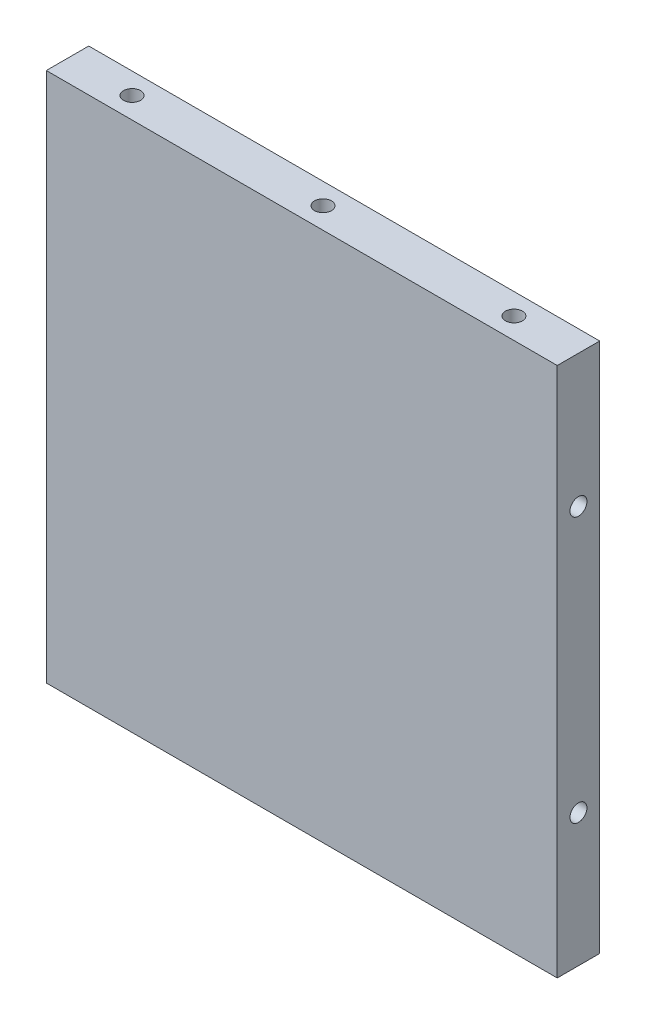
ISO-10303-21;
HEADER;
FILE_DESCRIPTION(('STEP AP214'),'2;1');
FILE_NAME('part.step','',(''),(''),'','','');
FILE_SCHEMA(('AUTOMOTIVE_DESIGN { 1 0 10303 214 1 1 1 1 }'));
ENDSEC;
DATA;
#1=APPLICATION_CONTEXT('core data for automotive mechanical design processes');
#2=APPLICATION_PROTOCOL_DEFINITION('international standard','automotive_design',2000,#1);
#3=PRODUCT_CONTEXT('',#1,'mechanical');
#4=PRODUCT('Part','Part','',(#3));
#5=PRODUCT_RELATED_PRODUCT_CATEGORY('part','',(#4));
#6=PRODUCT_DEFINITION_FORMATION('','',#4);
#7=PRODUCT_DEFINITION_CONTEXT('part definition',#1,'design');
#8=PRODUCT_DEFINITION('design','',#6,#7);
#9=PRODUCT_DEFINITION_SHAPE('','',#8);
#10=(LENGTH_UNIT() NAMED_UNIT(*) SI_UNIT(.MILLI.,.METRE.));
#11=(NAMED_UNIT(*) PLANE_ANGLE_UNIT() SI_UNIT($,.RADIAN.));
#12=(NAMED_UNIT(*) SI_UNIT($,.STERADIAN.) SOLID_ANGLE_UNIT());
#13=UNCERTAINTY_MEASURE_WITH_UNIT(LENGTH_MEASURE(1.E-05),#10,'distance_accuracy_value','');
#14=(GEOMETRIC_REPRESENTATION_CONTEXT(3) GLOBAL_UNCERTAINTY_ASSIGNED_CONTEXT((#13)) GLOBAL_UNIT_ASSIGNED_CONTEXT((#10,
#11,#12)) REPRESENTATION_CONTEXT('',''));
#15=CARTESIAN_POINT('',(0.,0.,0.));
#16=DIRECTION('',(0.,0.,1.));
#17=DIRECTION('',(1.,0.,0.));
#18=AXIS2_PLACEMENT_3D('',#15,#16,#17);
#19=CARTESIAN_POINT('',(0.,125.,0.));
#20=DIRECTION('',(1.,0.,0.));
#21=DIRECTION('',(0.,0.,-1.));
#22=AXIS2_PLACEMENT_3D('',#19,#20,#21);
#23=PLANE('',#22);
#24=CARTESIAN_POINT('',(0.,93.75,-5.));
#25=DIRECTION('',(-1.,0.,0.));
#26=DIRECTION('',(0.,0.,1.));
#27=AXIS2_PLACEMENT_3D('',#24,#25,#26);
#28=CIRCLE('',#27,2.);
#29=CARTESIAN_POINT('',(0.,93.75,-3.));
#30=VERTEX_POINT('',#29);
#31=EDGE_CURVE('E153',#30,#30,#28,.T.);
#32=ORIENTED_EDGE('',*,*,#31,.F.);
#33=EDGE_LOOP('',(#32));
#34=FACE_BOUND('',#33,.T.);
#35=CARTESIAN_POINT('',(0.,31.25,-5.));
#36=DIRECTION('',(-1.,0.,0.));
#37=DIRECTION('',(0.,0.,1.));
#38=AXIS2_PLACEMENT_3D('',#35,#36,#37);
#39=CIRCLE('',#38,2.);
#40=CARTESIAN_POINT('',(0.,31.25,-3.));
#41=VERTEX_POINT('',#40);
#42=EDGE_CURVE('E146',#41,#41,#39,.T.);
#43=ORIENTED_EDGE('',*,*,#42,.F.);
#44=EDGE_LOOP('',(#43));
#45=FACE_BOUND('',#44,.T.);
#46=DIRECTION('',(0.,0.,1.));
#47=VECTOR('',#46,1.);
#48=CARTESIAN_POINT('',(0.,0.,0.));
#49=LINE('',#48,#47);
#50=CARTESIAN_POINT('',(0.,0.,-10.));
#51=VERTEX_POINT('',#50);
#52=CARTESIAN_POINT('',(0.,0.,0.));
#53=VERTEX_POINT('',#52);
#54=EDGE_CURVE('E96',#51,#53,#49,.T.);
#55=ORIENTED_EDGE('',*,*,#54,.T.);
#56=DIRECTION('',(0.,-1.,0.));
#57=VECTOR('',#56,1.);
#58=CARTESIAN_POINT('',(0.,125.,0.));
#59=LINE('',#58,#57);
#60=CARTESIAN_POINT('',(0.,125.,0.));
#61=VERTEX_POINT('',#60);
#62=EDGE_CURVE('E11',#61,#53,#59,.T.);
#63=ORIENTED_EDGE('',*,*,#62,.F.);
#64=DIRECTION('',(0.,0.,1.));
#65=VECTOR('',#64,1.);
#66=CARTESIAN_POINT('',(0.,125.,0.));
#67=LINE('',#66,#65);
#68=CARTESIAN_POINT('',(0.,125.,-10.));
#69=VERTEX_POINT('',#68);
#70=EDGE_CURVE('E84',#69,#61,#67,.T.);
#71=ORIENTED_EDGE('',*,*,#70,.F.);
#72=DIRECTION('',(0.,-1.,0.));
#73=VECTOR('',#72,1.);
#74=CARTESIAN_POINT('',(0.,125.,-10.));
#75=LINE('',#74,#73);
#76=EDGE_CURVE('E92',#69,#51,#75,.T.);
#77=ORIENTED_EDGE('',*,*,#76,.T.);
#78=EDGE_LOOP('',(#55,#63,#71,#77));
#79=FACE_BOUND('',#78,.T.);
#80=ADVANCED_FACE('F33',(#34,#45,#79),#23,.F.);
#81=CARTESIAN_POINT('',(0.,125.,0.));
#82=DIRECTION('',(0.,0.,-1.));
#83=DIRECTION('',(-1.,0.,0.));
#84=AXIS2_PLACEMENT_3D('',#81,#82,#83);
#85=PLANE('',#84);
#86=DIRECTION('',(1.,0.,0.));
#87=VECTOR('',#86,1.);
#88=CARTESIAN_POINT('',(0.,0.,0.));
#89=LINE('',#88,#87);
#90=CARTESIAN_POINT('',(120.4,0.,0.));
#91=VERTEX_POINT('',#90);
#92=EDGE_CURVE('E88',#53,#91,#89,.T.);
#93=ORIENTED_EDGE('',*,*,#92,.T.);
#94=DIRECTION('',(0.,-1.,0.));
#95=VECTOR('',#94,1.);
#96=CARTESIAN_POINT('',(120.4,125.,0.));
#97=LINE('',#96,#95);
#98=CARTESIAN_POINT('',(120.4,125.,0.));
#99=VERTEX_POINT('',#98);
#100=EDGE_CURVE('E41',#99,#91,#97,.T.);
#101=ORIENTED_EDGE('',*,*,#100,.F.);
#102=DIRECTION('',(1.,0.,0.));
#103=VECTOR('',#102,1.);
#104=CARTESIAN_POINT('',(0.,125.,0.));
#105=LINE('',#104,#103);
#106=EDGE_CURVE('E79',#61,#99,#105,.T.);
#107=ORIENTED_EDGE('',*,*,#106,.F.);
#108=ORIENTED_EDGE('',*,*,#62,.T.);
#109=EDGE_LOOP('',(#93,#101,#107,#108));
#110=FACE_BOUND('',#109,.T.);
#111=ADVANCED_FACE('F87',(#110),#85,.F.);
#112=CARTESIAN_POINT('',(120.4,125.,0.));
#113=DIRECTION('',(-1.,0.,0.));
#114=DIRECTION('',(0.,0.,1.));
#115=AXIS2_PLACEMENT_3D('',#112,#113,#114);
#116=PLANE('',#115);
#117=CARTESIAN_POINT('',(120.4,93.75,-5.));
#118=DIRECTION('',(1.,0.,0.));
#119=DIRECTION('',(0.,0.,-1.));
#120=AXIS2_PLACEMENT_3D('',#117,#118,#119);
#121=CIRCLE('',#120,2.);
#122=CARTESIAN_POINT('',(120.4,93.75,-7.));
#123=VERTEX_POINT('',#122);
#124=EDGE_CURVE('E164',#123,#123,#121,.T.);
#125=ORIENTED_EDGE('',*,*,#124,.F.);
#126=EDGE_LOOP('',(#125));
#127=FACE_BOUND('',#126,.T.);
#128=CARTESIAN_POINT('',(120.4,31.25,-5.));
#129=DIRECTION('',(1.,0.,0.));
#130=DIRECTION('',(0.,0.,-1.));
#131=AXIS2_PLACEMENT_3D('',#128,#129,#130);
#132=CIRCLE('',#131,2.);
#133=CARTESIAN_POINT('',(120.4,31.25,-7.));
#134=VERTEX_POINT('',#133);
#135=EDGE_CURVE('E158',#134,#134,#132,.T.);
#136=ORIENTED_EDGE('',*,*,#135,.F.);
#137=EDGE_LOOP('',(#136));
#138=FACE_BOUND('',#137,.T.);
#139=DIRECTION('',(0.,0.,-1.));
#140=VECTOR('',#139,1.);
#141=CARTESIAN_POINT('',(120.4,0.,0.));
#142=LINE('',#141,#140);
#143=CARTESIAN_POINT('',(120.4,0.,-10.));
#144=VERTEX_POINT('',#143);
#145=EDGE_CURVE('E66',#91,#144,#142,.T.);
#146=ORIENTED_EDGE('',*,*,#145,.T.);
#147=DIRECTION('',(0.,-1.,0.));
#148=VECTOR('',#147,1.);
#149=CARTESIAN_POINT('',(120.4,125.,-10.));
#150=LINE('',#149,#148);
#151=CARTESIAN_POINT('',(120.4,125.,-10.));
#152=VERTEX_POINT('',#151);
#153=EDGE_CURVE('E89',#152,#144,#150,.T.);
#154=ORIENTED_EDGE('',*,*,#153,.F.);
#155=DIRECTION('',(0.,0.,-1.));
#156=VECTOR('',#155,1.);
#157=CARTESIAN_POINT('',(120.4,125.,0.));
#158=LINE('',#157,#156);
#159=EDGE_CURVE('E82',#99,#152,#158,.T.);
#160=ORIENTED_EDGE('',*,*,#159,.F.);
#161=ORIENTED_EDGE('',*,*,#100,.T.);
#162=EDGE_LOOP('',(#146,#154,#160,#161));
#163=FACE_BOUND('',#162,.T.);
#164=ADVANCED_FACE('F90',(#127,#138,#163),#116,.F.);
#165=CARTESIAN_POINT('',(0.,125.,-10.));
#166=DIRECTION('',(0.,0.,1.));
#167=DIRECTION('',(1.,0.,0.));
#168=AXIS2_PLACEMENT_3D('',#165,#166,#167);
#169=PLANE('',#168);
#170=DIRECTION('',(-1.,0.,0.));
#171=VECTOR('',#170,1.);
#172=CARTESIAN_POINT('',(0.,0.,-10.));
#173=LINE('',#172,#171);
#174=EDGE_CURVE('E72',#144,#51,#173,.T.);
#175=ORIENTED_EDGE('',*,*,#174,.T.);
#176=ORIENTED_EDGE('',*,*,#76,.F.);
#177=DIRECTION('',(-1.,0.,0.));
#178=VECTOR('',#177,1.);
#179=CARTESIAN_POINT('',(0.,125.,-10.));
#180=LINE('',#179,#178);
#181=EDGE_CURVE('E49',#152,#69,#180,.T.);
#182=ORIENTED_EDGE('',*,*,#181,.F.);
#183=ORIENTED_EDGE('',*,*,#153,.T.);
#184=EDGE_LOOP('',(#175,#176,#182,#183));
#185=FACE_BOUND('',#184,.T.);
#186=ADVANCED_FACE('F104',(#185),#169,.F.);
#187=CARTESIAN_POINT('',(0.,125.,0.));
#188=DIRECTION('',(0.,-1.,0.));
#189=DIRECTION('',(0.,0.,-1.));
#190=AXIS2_PLACEMENT_3D('',#187,#188,#189);
#191=PLANE('',#190);
#192=CARTESIAN_POINT('',(15.2,125.,-5.));
#193=DIRECTION('',(0.,1.,0.));
#194=DIRECTION('',(0.,0.,1.));
#195=AXIS2_PLACEMENT_3D('',#192,#193,#194);
#196=CIRCLE('',#195,2.);
#197=CARTESIAN_POINT('',(15.2,125.,-3.));
#198=VERTEX_POINT('',#197);
#199=EDGE_CURVE('E123',#198,#198,#196,.T.);
#200=ORIENTED_EDGE('',*,*,#199,.F.);
#201=EDGE_LOOP('',(#200));
#202=FACE_BOUND('',#201,.T.);
#203=CARTESIAN_POINT('',(60.2,125.,-5.));
#204=DIRECTION('',(0.,1.,0.));
#205=DIRECTION('',(0.,0.,1.));
#206=AXIS2_PLACEMENT_3D('',#203,#204,#205);
#207=CIRCLE('',#206,2.);
#208=CARTESIAN_POINT('',(60.2,125.,-3.));
#209=VERTEX_POINT('',#208);
#210=EDGE_CURVE('E117',#209,#209,#207,.T.);
#211=ORIENTED_EDGE('',*,*,#210,.F.);
#212=EDGE_LOOP('',(#211));
#213=FACE_BOUND('',#212,.T.);
#214=CARTESIAN_POINT('',(105.2,125.,-5.));
#215=DIRECTION('',(0.,1.,0.));
#216=DIRECTION('',(0.,0.,1.));
#217=AXIS2_PLACEMENT_3D('',#214,#215,#216);
#218=CIRCLE('',#217,2.);
#219=CARTESIAN_POINT('',(105.2,125.,-3.));
#220=VERTEX_POINT('',#219);
#221=EDGE_CURVE('E110',#220,#220,#218,.T.);
#222=ORIENTED_EDGE('',*,*,#221,.F.);
#223=EDGE_LOOP('',(#222));
#224=FACE_BOUND('',#223,.T.);
#225=ORIENTED_EDGE('',*,*,#70,.T.);
#226=ORIENTED_EDGE('',*,*,#106,.T.);
#227=ORIENTED_EDGE('',*,*,#159,.T.);
#228=ORIENTED_EDGE('',*,*,#181,.T.);
#229=EDGE_LOOP('',(#225,#226,#227,#228));
#230=FACE_BOUND('',#229,.T.);
#231=ADVANCED_FACE('F80',(#202,#213,#224,#230),#191,.F.);
#232=CARTESIAN_POINT('',(0.,0.,0.));
#233=DIRECTION('',(0.,-1.,0.));
#234=DIRECTION('',(0.,0.,-1.));
#235=AXIS2_PLACEMENT_3D('',#232,#233,#234);
#236=PLANE('',#235);
#237=CARTESIAN_POINT('',(15.2,0.,-5.));
#238=DIRECTION('',(0.,-1.,0.));
#239=DIRECTION('',(0.,0.,-1.));
#240=AXIS2_PLACEMENT_3D('',#237,#238,#239);
#241=CIRCLE('',#240,2.);
#242=CARTESIAN_POINT('',(15.2,0.,-7.));
#243=VERTEX_POINT('',#242);
#244=EDGE_CURVE('E141',#243,#243,#241,.T.);
#245=ORIENTED_EDGE('',*,*,#244,.F.);
#246=EDGE_LOOP('',(#245));
#247=FACE_BOUND('',#246,.T.);
#248=CARTESIAN_POINT('',(60.2,0.,-5.));
#249=DIRECTION('',(0.,-1.,0.));
#250=DIRECTION('',(0.,0.,-1.));
#251=AXIS2_PLACEMENT_3D('',#248,#249,#250);
#252=CIRCLE('',#251,2.);
#253=CARTESIAN_POINT('',(60.2,0.,-7.));
#254=VERTEX_POINT('',#253);
#255=EDGE_CURVE('E135',#254,#254,#252,.T.);
#256=ORIENTED_EDGE('',*,*,#255,.F.);
#257=EDGE_LOOP('',(#256));
#258=FACE_BOUND('',#257,.T.);
#259=CARTESIAN_POINT('',(105.2,0.,-5.));
#260=DIRECTION('',(0.,-1.,0.));
#261=DIRECTION('',(0.,0.,-1.));
#262=AXIS2_PLACEMENT_3D('',#259,#260,#261);
#263=CIRCLE('',#262,2.);
#264=CARTESIAN_POINT('',(105.2,0.,-7.));
#265=VERTEX_POINT('',#264);
#266=EDGE_CURVE('E128',#265,#265,#263,.T.);
#267=ORIENTED_EDGE('',*,*,#266,.F.);
#268=EDGE_LOOP('',(#267));
#269=FACE_BOUND('',#268,.T.);
#270=ORIENTED_EDGE('',*,*,#54,.F.);
#271=ORIENTED_EDGE('',*,*,#174,.F.);
#272=ORIENTED_EDGE('',*,*,#145,.F.);
#273=ORIENTED_EDGE('',*,*,#92,.F.);
#274=EDGE_LOOP('',(#270,#271,#272,#273));
#275=FACE_BOUND('',#274,.T.);
#276=ADVANCED_FACE('F107',(#247,#258,#269,#275),#236,.T.);
#277=CARTESIAN_POINT('',(105.2,115.,-5.));
#278=DIRECTION('',(0.,1.,0.));
#279=DIRECTION('',(0.,0.,1.));
#280=AXIS2_PLACEMENT_3D('',#277,#278,#279);
#281=CYLINDRICAL_SURFACE('',#280,2.);
#282=CARTESIAN_POINT('',(105.2,115.,-5.));
#283=DIRECTION('',(0.,1.,0.));
#284=DIRECTION('',(0.,0.,1.));
#285=AXIS2_PLACEMENT_3D('',#282,#283,#284);
#286=CIRCLE('',#285,2.);
#287=CARTESIAN_POINT('',(105.2,115.,-3.));
#288=VERTEX_POINT('',#287);
#289=EDGE_CURVE('E113',#288,#288,#286,.T.);
#290=ORIENTED_EDGE('',*,*,#289,.F.);
#291=EDGE_LOOP('',(#290));
#292=FACE_BOUND('',#291,.T.);
#293=ORIENTED_EDGE('',*,*,#221,.T.);
#294=EDGE_LOOP('',(#293));
#295=FACE_BOUND('',#294,.T.);
#296=ADVANCED_FACE('F265',(#292,#295),#281,.F.);
#297=CARTESIAN_POINT('',(105.2,115.,-5.));
#298=DIRECTION('',(0.,1.,0.));
#299=DIRECTION('',(0.,0.,1.));
#300=AXIS2_PLACEMENT_3D('',#297,#298,#299);
#301=PLANE('',#300);
#302=ORIENTED_EDGE('',*,*,#289,.T.);
#303=EDGE_LOOP('',(#302));
#304=FACE_BOUND('',#303,.T.);
#305=ADVANCED_FACE('F261',(#304),#301,.T.);
#306=CARTESIAN_POINT('',(60.2,115.,-5.));
#307=DIRECTION('',(0.,1.,0.));
#308=DIRECTION('',(0.,0.,1.));
#309=AXIS2_PLACEMENT_3D('',#306,#307,#308);
#310=CYLINDRICAL_SURFACE('',#309,2.);
#311=CARTESIAN_POINT('',(60.2,115.,-5.));
#312=DIRECTION('',(0.,1.,0.));
#313=DIRECTION('',(0.,0.,1.));
#314=AXIS2_PLACEMENT_3D('',#311,#312,#313);
#315=CIRCLE('',#314,2.);
#316=CARTESIAN_POINT('',(60.2,115.,-3.));
#317=VERTEX_POINT('',#316);
#318=EDGE_CURVE('E120',#317,#317,#315,.T.);
#319=ORIENTED_EDGE('',*,*,#318,.F.);
#320=EDGE_LOOP('',(#319));
#321=FACE_BOUND('',#320,.T.);
#322=ORIENTED_EDGE('',*,*,#210,.T.);
#323=EDGE_LOOP('',(#322));
#324=FACE_BOUND('',#323,.T.);
#325=ADVANCED_FACE('F257',(#321,#324),#310,.F.);
#326=CARTESIAN_POINT('',(60.2,115.,-5.));
#327=DIRECTION('',(0.,1.,0.));
#328=DIRECTION('',(0.,0.,1.));
#329=AXIS2_PLACEMENT_3D('',#326,#327,#328);
#330=PLANE('',#329);
#331=ORIENTED_EDGE('',*,*,#318,.T.);
#332=EDGE_LOOP('',(#331));
#333=FACE_BOUND('',#332,.T.);
#334=ADVANCED_FACE('F253',(#333),#330,.T.);
#335=CARTESIAN_POINT('',(15.2,115.,-5.));
#336=DIRECTION('',(0.,1.,0.));
#337=DIRECTION('',(0.,0.,1.));
#338=AXIS2_PLACEMENT_3D('',#335,#336,#337);
#339=CYLINDRICAL_SURFACE('',#338,2.);
#340=CARTESIAN_POINT('',(15.2,115.,-5.));
#341=DIRECTION('',(0.,1.,0.));
#342=DIRECTION('',(0.,0.,1.));
#343=AXIS2_PLACEMENT_3D('',#340,#341,#342);
#344=CIRCLE('',#343,2.);
#345=CARTESIAN_POINT('',(15.2,115.,-3.));
#346=VERTEX_POINT('',#345);
#347=EDGE_CURVE('E99',#346,#346,#344,.T.);
#348=ORIENTED_EDGE('',*,*,#347,.F.);
#349=EDGE_LOOP('',(#348));
#350=FACE_BOUND('',#349,.T.);
#351=ORIENTED_EDGE('',*,*,#199,.T.);
#352=EDGE_LOOP('',(#351));
#353=FACE_BOUND('',#352,.T.);
#354=ADVANCED_FACE('F249',(#350,#353),#339,.F.);
#355=CARTESIAN_POINT('',(15.2,115.,-5.));
#356=DIRECTION('',(0.,1.,0.));
#357=DIRECTION('',(0.,0.,1.));
#358=AXIS2_PLACEMENT_3D('',#355,#356,#357);
#359=PLANE('',#358);
#360=ORIENTED_EDGE('',*,*,#347,.T.);
#361=EDGE_LOOP('',(#360));
#362=FACE_BOUND('',#361,.T.);
#363=ADVANCED_FACE('F245',(#362),#359,.T.);
#364=CARTESIAN_POINT('',(105.2,10.,-5.));
#365=DIRECTION('',(0.,-1.,0.));
#366=DIRECTION('',(0.,0.,-1.));
#367=AXIS2_PLACEMENT_3D('',#364,#365,#366);
#368=CYLINDRICAL_SURFACE('',#367,2.);
#369=CARTESIAN_POINT('',(105.2,10.,-5.));
#370=DIRECTION('',(0.,-1.,0.));
#371=DIRECTION('',(0.,0.,-1.));
#372=AXIS2_PLACEMENT_3D('',#369,#370,#371);
#373=CIRCLE('',#372,2.);
#374=CARTESIAN_POINT('',(105.2,10.,-7.));
#375=VERTEX_POINT('',#374);
#376=EDGE_CURVE('E131',#375,#375,#373,.T.);
#377=ORIENTED_EDGE('',*,*,#376,.F.);
#378=EDGE_LOOP('',(#377));
#379=FACE_BOUND('',#378,.T.);
#380=ORIENTED_EDGE('',*,*,#266,.T.);
#381=EDGE_LOOP('',(#380));
#382=FACE_BOUND('',#381,.T.);
#383=ADVANCED_FACE('F241',(#379,#382),#368,.F.);
#384=CARTESIAN_POINT('',(105.2,10.,-5.));
#385=DIRECTION('',(0.,-1.,0.));
#386=DIRECTION('',(0.,0.,-1.));
#387=AXIS2_PLACEMENT_3D('',#384,#385,#386);
#388=PLANE('',#387);
#389=ORIENTED_EDGE('',*,*,#376,.T.);
#390=EDGE_LOOP('',(#389));
#391=FACE_BOUND('',#390,.T.);
#392=ADVANCED_FACE('F237',(#391),#388,.T.);
#393=CARTESIAN_POINT('',(60.2,10.,-5.));
#394=DIRECTION('',(0.,-1.,0.));
#395=DIRECTION('',(0.,0.,-1.));
#396=AXIS2_PLACEMENT_3D('',#393,#394,#395);
#397=CYLINDRICAL_SURFACE('',#396,2.);
#398=CARTESIAN_POINT('',(60.2,10.,-5.));
#399=DIRECTION('',(0.,-1.,0.));
#400=DIRECTION('',(0.,0.,-1.));
#401=AXIS2_PLACEMENT_3D('',#398,#399,#400);
#402=CIRCLE('',#401,2.);
#403=CARTESIAN_POINT('',(60.2,10.,-7.));
#404=VERTEX_POINT('',#403);
#405=EDGE_CURVE('E138',#404,#404,#402,.T.);
#406=ORIENTED_EDGE('',*,*,#405,.F.);
#407=EDGE_LOOP('',(#406));
#408=FACE_BOUND('',#407,.T.);
#409=ORIENTED_EDGE('',*,*,#255,.T.);
#410=EDGE_LOOP('',(#409));
#411=FACE_BOUND('',#410,.T.);
#412=ADVANCED_FACE('F233',(#408,#411),#397,.F.);
#413=CARTESIAN_POINT('',(60.2,10.,-5.));
#414=DIRECTION('',(0.,-1.,0.));
#415=DIRECTION('',(0.,0.,-1.));
#416=AXIS2_PLACEMENT_3D('',#413,#414,#415);
#417=PLANE('',#416);
#418=ORIENTED_EDGE('',*,*,#405,.T.);
#419=EDGE_LOOP('',(#418));
#420=FACE_BOUND('',#419,.T.);
#421=ADVANCED_FACE('F229',(#420),#417,.T.);
#422=CARTESIAN_POINT('',(15.2,10.,-5.));
#423=DIRECTION('',(0.,-1.,0.));
#424=DIRECTION('',(0.,0.,-1.));
#425=AXIS2_PLACEMENT_3D('',#422,#423,#424);
#426=CYLINDRICAL_SURFACE('',#425,2.);
#427=CARTESIAN_POINT('',(15.2,10.,-5.));
#428=DIRECTION('',(0.,-1.,0.));
#429=DIRECTION('',(0.,0.,-1.));
#430=AXIS2_PLACEMENT_3D('',#427,#428,#429);
#431=CIRCLE('',#430,2.);
#432=CARTESIAN_POINT('',(15.2,10.,-7.));
#433=VERTEX_POINT('',#432);
#434=EDGE_CURVE('E114',#433,#433,#431,.T.);
#435=ORIENTED_EDGE('',*,*,#434,.F.);
#436=EDGE_LOOP('',(#435));
#437=FACE_BOUND('',#436,.T.);
#438=ORIENTED_EDGE('',*,*,#244,.T.);
#439=EDGE_LOOP('',(#438));
#440=FACE_BOUND('',#439,.T.);
#441=ADVANCED_FACE('F221',(#437,#440),#426,.F.);
#442=CARTESIAN_POINT('',(15.2,10.,-5.));
#443=DIRECTION('',(0.,-1.,0.));
#444=DIRECTION('',(0.,0.,-1.));
#445=AXIS2_PLACEMENT_3D('',#442,#443,#444);
#446=PLANE('',#445);
#447=ORIENTED_EDGE('',*,*,#434,.T.);
#448=EDGE_LOOP('',(#447));
#449=FACE_BOUND('',#448,.T.);
#450=ADVANCED_FACE('F213',(#449),#446,.T.);
#451=CARTESIAN_POINT('',(10.,31.25,-5.));
#452=DIRECTION('',(-1.,0.,0.));
#453=DIRECTION('',(0.,0.,1.));
#454=AXIS2_PLACEMENT_3D('',#451,#452,#453);
#455=CYLINDRICAL_SURFACE('',#454,2.);
#456=CARTESIAN_POINT('',(10.,31.25,-5.));
#457=DIRECTION('',(-1.,0.,0.));
#458=DIRECTION('',(0.,0.,1.));
#459=AXIS2_PLACEMENT_3D('',#456,#457,#458);
#460=CIRCLE('',#459,2.);
#461=CARTESIAN_POINT('',(10.,31.25,-3.));
#462=VERTEX_POINT('',#461);
#463=EDGE_CURVE('E149',#462,#462,#460,.T.);
#464=ORIENTED_EDGE('',*,*,#463,.F.);
#465=EDGE_LOOP('',(#464));
#466=FACE_BOUND('',#465,.T.);
#467=ORIENTED_EDGE('',*,*,#42,.T.);
#468=EDGE_LOOP('',(#467));
#469=FACE_BOUND('',#468,.T.);
#470=ADVANCED_FACE('F210',(#466,#469),#455,.F.);
#471=CARTESIAN_POINT('',(10.,31.25,-5.));
#472=DIRECTION('',(-1.,0.,0.));
#473=DIRECTION('',(0.,0.,1.));
#474=AXIS2_PLACEMENT_3D('',#471,#472,#473);
#475=PLANE('',#474);
#476=ORIENTED_EDGE('',*,*,#463,.T.);
#477=EDGE_LOOP('',(#476));
#478=FACE_BOUND('',#477,.T.);
#479=ADVANCED_FACE('F212',(#478),#475,.T.);
#480=CARTESIAN_POINT('',(10.,93.75,-5.));
#481=DIRECTION('',(-1.,0.,0.));
#482=DIRECTION('',(0.,0.,1.));
#483=AXIS2_PLACEMENT_3D('',#480,#481,#482);
#484=CYLINDRICAL_SURFACE('',#483,2.);
#485=CARTESIAN_POINT('',(10.,93.75,-5.));
#486=DIRECTION('',(-1.,0.,0.));
#487=DIRECTION('',(0.,0.,1.));
#488=AXIS2_PLACEMENT_3D('',#485,#486,#487);
#489=CIRCLE('',#488,2.);
#490=CARTESIAN_POINT('',(10.,93.75,-3.));
#491=VERTEX_POINT('',#490);
#492=EDGE_CURVE('E132',#491,#491,#489,.T.);
#493=ORIENTED_EDGE('',*,*,#492,.F.);
#494=EDGE_LOOP('',(#493));
#495=FACE_BOUND('',#494,.T.);
#496=ORIENTED_EDGE('',*,*,#31,.T.);
#497=EDGE_LOOP('',(#496));
#498=FACE_BOUND('',#497,.T.);
#499=ADVANCED_FACE('F195',(#495,#498),#484,.F.);
#500=CARTESIAN_POINT('',(10.,93.75,-5.));
#501=DIRECTION('',(-1.,0.,0.));
#502=DIRECTION('',(0.,0.,1.));
#503=AXIS2_PLACEMENT_3D('',#500,#501,#502);
#504=PLANE('',#503);
#505=ORIENTED_EDGE('',*,*,#492,.T.);
#506=EDGE_LOOP('',(#505));
#507=FACE_BOUND('',#506,.T.);
#508=ADVANCED_FACE('F186',(#507),#504,.T.);
#509=CARTESIAN_POINT('',(110.4,31.25,-5.));
#510=DIRECTION('',(1.,0.,0.));
#511=DIRECTION('',(0.,0.,-1.));
#512=AXIS2_PLACEMENT_3D('',#509,#510,#511);
#513=CYLINDRICAL_SURFACE('',#512,2.);
#514=CARTESIAN_POINT('',(110.4,31.25,-5.));
#515=DIRECTION('',(1.,0.,0.));
#516=DIRECTION('',(0.,0.,-1.));
#517=AXIS2_PLACEMENT_3D('',#514,#515,#516);
#518=CIRCLE('',#517,2.);
#519=CARTESIAN_POINT('',(110.4,31.25,-7.));
#520=VERTEX_POINT('',#519);
#521=EDGE_CURVE('E161',#520,#520,#518,.T.);
#522=ORIENTED_EDGE('',*,*,#521,.F.);
#523=EDGE_LOOP('',(#522));
#524=FACE_BOUND('',#523,.T.);
#525=ORIENTED_EDGE('',*,*,#135,.T.);
#526=EDGE_LOOP('',(#525));
#527=FACE_BOUND('',#526,.T.);
#528=ADVANCED_FACE('F184',(#524,#527),#513,.F.);
#529=CARTESIAN_POINT('',(110.4,31.25,-5.));
#530=DIRECTION('',(1.,0.,0.));
#531=DIRECTION('',(0.,0.,-1.));
#532=AXIS2_PLACEMENT_3D('',#529,#530,#531);
#533=PLANE('',#532);
#534=ORIENTED_EDGE('',*,*,#521,.T.);
#535=EDGE_LOOP('',(#534));
#536=FACE_BOUND('',#535,.T.);
#537=ADVANCED_FACE('F175',(#536),#533,.T.);
#538=CARTESIAN_POINT('',(110.4,93.75,-5.));
#539=DIRECTION('',(1.,0.,0.));
#540=DIRECTION('',(0.,0.,-1.));
#541=AXIS2_PLACEMENT_3D('',#538,#539,#540);
#542=CYLINDRICAL_SURFACE('',#541,2.);
#543=CARTESIAN_POINT('',(110.4,93.75,-5.));
#544=DIRECTION('',(1.,0.,0.));
#545=DIRECTION('',(0.,0.,-1.));
#546=AXIS2_PLACEMENT_3D('',#543,#544,#545);
#547=CIRCLE('',#546,2.);
#548=CARTESIAN_POINT('',(110.4,93.75,-7.));
#549=VERTEX_POINT('',#548);
#550=EDGE_CURVE('E150',#549,#549,#547,.T.);
#551=ORIENTED_EDGE('',*,*,#550,.F.);
#552=EDGE_LOOP('',(#551));
#553=FACE_BOUND('',#552,.T.);
#554=ORIENTED_EDGE('',*,*,#124,.T.);
#555=EDGE_LOOP('',(#554));
#556=FACE_BOUND('',#555,.T.);
#557=ADVANCED_FACE('F172',(#553,#556),#542,.F.);
#558=CARTESIAN_POINT('',(110.4,93.75,-5.));
#559=DIRECTION('',(1.,0.,0.));
#560=DIRECTION('',(0.,0.,-1.));
#561=AXIS2_PLACEMENT_3D('',#558,#559,#560);
#562=PLANE('',#561);
#563=ORIENTED_EDGE('',*,*,#550,.T.);
#564=EDGE_LOOP('',(#563));
#565=FACE_BOUND('',#564,.T.);
#566=ADVANCED_FACE('F170',(#565),#562,.T.);
#567=CLOSED_SHELL('',(#80,#111,#164,#186,#231,#276,#296,#305,#325,#334,#354,#363,#383,#392,#412,
#421,#441,#450,#470,#479,#499,#508,#528,#537,#557,#566));
#568=MANIFOLD_SOLID_BREP('B2',#567);
#569=ADVANCED_BREP_SHAPE_REPRESENTATION('',(#18,#568),#14);
#570=SHAPE_DEFINITION_REPRESENTATION(#9,#569);
ENDSEC;
END-ISO-10303-21;
